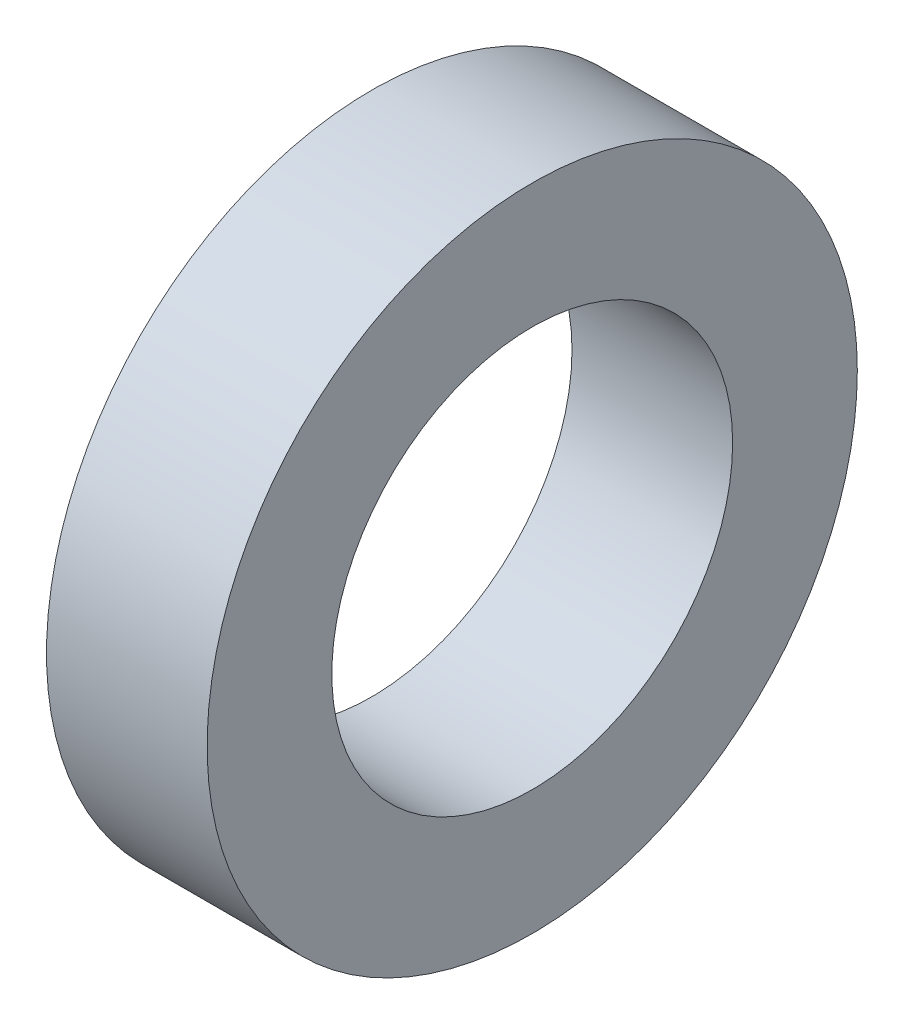
ISO-10303-21;
HEADER;
FILE_DESCRIPTION(('STEP AP214'),'2;1');
FILE_NAME('part.step','',(''),(''),'','','');
FILE_SCHEMA(('AUTOMOTIVE_DESIGN { 1 0 10303 214 1 1 1 1 }'));
ENDSEC;
DATA;
#1=APPLICATION_CONTEXT('core data for automotive mechanical design processes');
#2=APPLICATION_PROTOCOL_DEFINITION('international standard','automotive_design',2000,#1);
#3=PRODUCT_CONTEXT('',#1,'mechanical');
#4=PRODUCT('Part','Part','',(#3));
#5=PRODUCT_RELATED_PRODUCT_CATEGORY('part','',(#4));
#6=PRODUCT_DEFINITION_FORMATION('','',#4);
#7=PRODUCT_DEFINITION_CONTEXT('part definition',#1,'design');
#8=PRODUCT_DEFINITION('design','',#6,#7);
#9=PRODUCT_DEFINITION_SHAPE('','',#8);
#10=(LENGTH_UNIT() NAMED_UNIT(*) SI_UNIT(.MILLI.,.METRE.));
#11=(NAMED_UNIT(*) PLANE_ANGLE_UNIT() SI_UNIT($,.RADIAN.));
#12=(NAMED_UNIT(*) SI_UNIT($,.STERADIAN.) SOLID_ANGLE_UNIT());
#13=UNCERTAINTY_MEASURE_WITH_UNIT(LENGTH_MEASURE(1.E-05),#10,'distance_accuracy_value','');
#14=(GEOMETRIC_REPRESENTATION_CONTEXT(3) GLOBAL_UNCERTAINTY_ASSIGNED_CONTEXT((#13)) GLOBAL_UNIT_ASSIGNED_CONTEXT((#10,
#11,#12)) REPRESENTATION_CONTEXT('',''));
#15=CARTESIAN_POINT('',(0.,0.,0.));
#16=DIRECTION('',(0.,0.,1.));
#17=DIRECTION('',(1.,0.,0.));
#18=AXIS2_PLACEMENT_3D('',#15,#16,#17);
#19=CARTESIAN_POINT('',(2.667,0.,0.));
#20=DIRECTION('',(1.,0.,0.));
#21=DIRECTION('',(0.,0.,-1.));
#22=AXIS2_PLACEMENT_3D('',#19,#20,#21);
#23=PLANE('',#22);
#24=CARTESIAN_POINT('',(2.667,0.,0.));
#25=DIRECTION('',(1.,0.,0.));
#26=DIRECTION('',(0.,0.,-1.));
#27=AXIS2_PLACEMENT_3D('',#24,#25,#26);
#28=CIRCLE('',#27,5.3975);
#29=CARTESIAN_POINT('',(2.667,0.,-5.3975));
#30=VERTEX_POINT('',#29);
#31=EDGE_CURVE('E10',#30,#30,#28,.T.);
#32=ORIENTED_EDGE('',*,*,#31,.T.);
#33=EDGE_LOOP('',(#32));
#34=FACE_BOUND('',#33,.T.);
#35=CARTESIAN_POINT('',(2.667,0.,0.));
#36=DIRECTION('',(1.,0.,0.));
#37=DIRECTION('',(0.,0.,-1.));
#38=AXIS2_PLACEMENT_3D('',#35,#36,#37);
#39=CIRCLE('',#38,3.3274);
#40=CARTESIAN_POINT('',(2.667,0.,-3.3274));
#41=VERTEX_POINT('',#40);
#42=EDGE_CURVE('E56',#41,#41,#39,.T.);
#43=ORIENTED_EDGE('',*,*,#42,.F.);
#44=EDGE_LOOP('',(#43));
#45=FACE_BOUND('',#44,.T.);
#46=ADVANCED_FACE('F43',(#34,#45),#23,.T.);
#47=CARTESIAN_POINT('',(0.,0.,0.));
#48=DIRECTION('',(1.,0.,0.));
#49=DIRECTION('',(0.,0.,-1.));
#50=AXIS2_PLACEMENT_3D('',#47,#48,#49);
#51=PLANE('',#50);
#52=CARTESIAN_POINT('',(0.,0.,0.));
#53=DIRECTION('',(1.,0.,0.));
#54=DIRECTION('',(0.,0.,-1.));
#55=AXIS2_PLACEMENT_3D('',#52,#53,#54);
#56=CIRCLE('',#55,5.3975);
#57=CARTESIAN_POINT('',(0.,0.,-5.3975));
#58=VERTEX_POINT('',#57);
#59=EDGE_CURVE('E47',#58,#58,#56,.T.);
#60=ORIENTED_EDGE('',*,*,#59,.F.);
#61=EDGE_LOOP('',(#60));
#62=FACE_BOUND('',#61,.T.);
#63=CARTESIAN_POINT('',(0.,0.,0.));
#64=DIRECTION('',(1.,0.,0.));
#65=DIRECTION('',(0.,0.,-1.));
#66=AXIS2_PLACEMENT_3D('',#63,#64,#65);
#67=CIRCLE('',#66,3.3274);
#68=CARTESIAN_POINT('',(0.,0.,-3.3274));
#69=VERTEX_POINT('',#68);
#70=EDGE_CURVE('E58',#69,#69,#67,.T.);
#71=ORIENTED_EDGE('',*,*,#70,.T.);
#72=EDGE_LOOP('',(#71));
#73=FACE_BOUND('',#72,.T.);
#74=ADVANCED_FACE('F70',(#62,#73),#51,.F.);
#75=CARTESIAN_POINT('',(2.667,0.,0.));
#76=DIRECTION('',(-1.,0.,0.));
#77=DIRECTION('',(0.,0.,1.));
#78=AXIS2_PLACEMENT_3D('',#75,#76,#77);
#79=CYLINDRICAL_SURFACE('',#78,5.3975);
#80=ORIENTED_EDGE('',*,*,#31,.F.);
#81=EDGE_LOOP('',(#80));
#82=FACE_BOUND('',#81,.T.);
#83=ORIENTED_EDGE('',*,*,#59,.T.);
#84=EDGE_LOOP('',(#83));
#85=FACE_BOUND('',#84,.T.);
#86=ADVANCED_FACE('F45',(#82,#85),#79,.T.);
#87=CARTESIAN_POINT('',(2.667,0.,0.));
#88=DIRECTION('',(-1.,0.,0.));
#89=DIRECTION('',(0.,0.,1.));
#90=AXIS2_PLACEMENT_3D('',#87,#88,#89);
#91=CYLINDRICAL_SURFACE('',#90,3.3274);
#92=ORIENTED_EDGE('',*,*,#42,.T.);
#93=EDGE_LOOP('',(#92));
#94=FACE_BOUND('',#93,.T.);
#95=ORIENTED_EDGE('',*,*,#70,.F.);
#96=EDGE_LOOP('',(#95));
#97=FACE_BOUND('',#96,.T.);
#98=ADVANCED_FACE('F66',(#94,#97),#91,.F.);
#99=CLOSED_SHELL('',(#46,#74,#86,#98));
#100=MANIFOLD_SOLID_BREP('B2',#99);
#101=ADVANCED_BREP_SHAPE_REPRESENTATION('',(#18,#100),#14);
#102=SHAPE_DEFINITION_REPRESENTATION(#9,#101);
ENDSEC;
END-ISO-10303-21;
